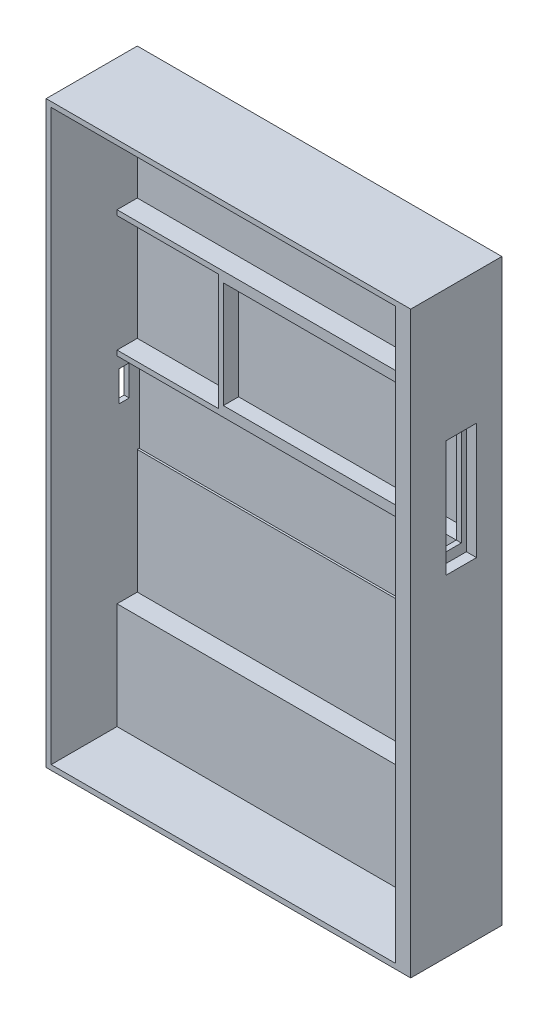
ISO-10303-21;
HEADER;
FILE_DESCRIPTION(('STEP AP214'),'2;1');
FILE_NAME('part.step','',(''),(''),'','','');
FILE_SCHEMA(('AUTOMOTIVE_DESIGN { 1 0 10303 214 1 1 1 1 }'));
ENDSEC;
DATA;
#1=APPLICATION_CONTEXT('core data for automotive mechanical design processes');
#2=APPLICATION_PROTOCOL_DEFINITION('international standard','automotive_design',2000,#1);
#3=PRODUCT_CONTEXT('',#1,'mechanical');
#4=PRODUCT('Part','Part','',(#3));
#5=PRODUCT_RELATED_PRODUCT_CATEGORY('part','',(#4));
#6=PRODUCT_DEFINITION_FORMATION('','',#4);
#7=PRODUCT_DEFINITION_CONTEXT('part definition',#1,'design');
#8=PRODUCT_DEFINITION('design','',#6,#7);
#9=PRODUCT_DEFINITION_SHAPE('','',#8);
#10=(LENGTH_UNIT() NAMED_UNIT(*) SI_UNIT(.MILLI.,.METRE.));
#11=(NAMED_UNIT(*) PLANE_ANGLE_UNIT() SI_UNIT($,.RADIAN.));
#12=(NAMED_UNIT(*) SI_UNIT($,.STERADIAN.) SOLID_ANGLE_UNIT());
#13=UNCERTAINTY_MEASURE_WITH_UNIT(LENGTH_MEASURE(1.E-05),#10,'distance_accuracy_value','');
#14=(GEOMETRIC_REPRESENTATION_CONTEXT(3) GLOBAL_UNCERTAINTY_ASSIGNED_CONTEXT((#13)) GLOBAL_UNIT_ASSIGNED_CONTEXT((#10,
#11,#12)) REPRESENTATION_CONTEXT('',''));
#15=CARTESIAN_POINT('',(0.,0.,0.));
#16=DIRECTION('',(0.,0.,1.));
#17=DIRECTION('',(1.,0.,0.));
#18=AXIS2_PLACEMENT_3D('',#15,#16,#17);
#19=CARTESIAN_POINT('',(0.,67.4,18.));
#20=DIRECTION('',(0.,-1.,0.));
#21=DIRECTION('',(0.,0.,-1.));
#22=AXIS2_PLACEMENT_3D('',#19,#20,#21);
#23=PLANE('',#22);
#24=DIRECTION('',(1.,0.,0.));
#25=VECTOR('',#24,1.);
#26=CARTESIAN_POINT('',(0.,67.4,5.));
#27=LINE('',#26,#25);
#28=CARTESIAN_POINT('',(0.,67.4,5.));
#29=VERTEX_POINT('',#28);
#30=CARTESIAN_POINT('',(68.,67.4,5.));
#31=VERTEX_POINT('',#30);
#32=EDGE_CURVE('E441',#29,#31,#27,.T.);
#33=ORIENTED_EDGE('',*,*,#32,.T.);
#34=DIRECTION('',(0.,0.,-1.));
#35=VECTOR('',#34,1.);
#36=CARTESIAN_POINT('',(68.,67.4,18.));
#37=LINE('',#36,#35);
#38=CARTESIAN_POINT('',(68.,67.4,1.));
#39=VERTEX_POINT('',#38);
#40=EDGE_CURVE('E494',#31,#39,#37,.T.);
#41=ORIENTED_EDGE('',*,*,#40,.T.);
#42=DIRECTION('',(1.,0.,0.));
#43=VECTOR('',#42,1.);
#44=CARTESIAN_POINT('',(0.,67.4,1.));
#45=LINE('',#44,#43);
#46=CARTESIAN_POINT('',(0.,67.4,1.));
#47=VERTEX_POINT('',#46);
#48=EDGE_CURVE('E508',#47,#39,#45,.T.);
#49=ORIENTED_EDGE('',*,*,#48,.F.);
#50=DIRECTION('',(0.,0.,-1.));
#51=VECTOR('',#50,1.);
#52=CARTESIAN_POINT('',(0.,67.4,18.));
#53=LINE('',#52,#51);
#54=EDGE_CURVE('E496',#29,#47,#53,.T.);
#55=ORIENTED_EDGE('',*,*,#54,.F.);
#56=EDGE_LOOP('',(#33,#41,#49,#55));
#57=FACE_BOUND('',#56,.T.);
#58=ADVANCED_FACE('F129',(#57),#23,.F.);
#59=CARTESIAN_POINT('',(55.8,0.,18.));
#60=DIRECTION('',(-1.,0.,0.));
#61=DIRECTION('',(0.,0.,1.));
#62=AXIS2_PLACEMENT_3D('',#59,#60,#61);
#63=PLANE('',#62);
#64=DIRECTION('',(0.,0.,-1.));
#65=VECTOR('',#64,1.);
#66=CARTESIAN_POINT('',(55.8,0.,18.));
#67=LINE('',#66,#65);
#68=CARTESIAN_POINT('',(55.8,0.,5.));
#69=VERTEX_POINT('',#68);
#70=CARTESIAN_POINT('',(55.8,0.,1.));
#71=VERTEX_POINT('',#70);
#72=EDGE_CURVE('E624',#69,#71,#67,.T.);
#73=ORIENTED_EDGE('',*,*,#72,.F.);
#74=DIRECTION('',(0.,1.,0.));
#75=VECTOR('',#74,1.);
#76=CARTESIAN_POINT('',(55.8,-21.,5.));
#77=LINE('',#76,#75);
#78=CARTESIAN_POINT('',(55.8,42.4,5.));
#79=VERTEX_POINT('',#78);
#80=EDGE_CURVE('E396',#69,#79,#77,.T.);
#81=ORIENTED_EDGE('',*,*,#80,.T.);
#82=DIRECTION('',(0.,0.,-1.));
#83=VECTOR('',#82,1.);
#84=CARTESIAN_POINT('',(55.8,42.4,18.));
#85=LINE('',#84,#83);
#86=CARTESIAN_POINT('',(55.8,42.4,0.6));
#87=VERTEX_POINT('',#86);
#88=EDGE_CURVE('E622',#79,#87,#85,.T.);
#89=ORIENTED_EDGE('',*,*,#88,.T.);
#90=DIRECTION('',(0.,1.,0.));
#91=VECTOR('',#90,1.);
#92=CARTESIAN_POINT('',(55.8,42.4,0.6));
#93=LINE('',#92,#91);
#94=CARTESIAN_POINT('',(55.8,24.4,0.6));
#95=VERTEX_POINT('',#94);
#96=EDGE_CURVE('E564',#95,#87,#93,.T.);
#97=ORIENTED_EDGE('',*,*,#96,.F.);
#98=DIRECTION('',(0.,0.,1.));
#99=VECTOR('',#98,1.);
#100=CARTESIAN_POINT('',(55.8,24.4,0.6));
#101=LINE('',#100,#99);
#102=CARTESIAN_POINT('',(55.8,24.4,1.));
#103=VERTEX_POINT('',#102);
#104=EDGE_CURVE('E573',#95,#103,#101,.T.);
#105=ORIENTED_EDGE('',*,*,#104,.T.);
#106=DIRECTION('',(0.,1.,0.));
#107=VECTOR('',#106,1.);
#108=CARTESIAN_POINT('',(55.8,0.,1.));
#109=LINE('',#108,#107);
#110=EDGE_CURVE('E615',#71,#103,#109,.T.);
#111=ORIENTED_EDGE('',*,*,#110,.F.);
#112=EDGE_LOOP('',(#73,#81,#89,#97,#105,#111));
#113=FACE_BOUND('',#112,.T.);
#114=ADVANCED_FACE('F694',(#113),#63,.T.);
#115=CARTESIAN_POINT('',(0.,0.,18.));
#116=DIRECTION('',(0.,0.,1.));
#117=DIRECTION('',(1.,0.,0.));
#118=AXIS2_PLACEMENT_3D('',#115,#116,#117);
#119=PLANE('',#118);
#120=DIRECTION('',(0.,-1.,0.));
#121=VECTOR('',#120,1.);
#122=CARTESIAN_POINT('',(-1.,0.,18.));
#123=LINE('',#122,#121);
#124=CARTESIAN_POINT('',(-1.,92.4,18.));
#125=VERTEX_POINT('',#124);
#126=CARTESIAN_POINT('',(-1.,-22.,18.));
#127=VERTEX_POINT('',#126);
#128=EDGE_CURVE('E630',#125,#127,#123,.T.);
#129=ORIENTED_EDGE('',*,*,#128,.T.);
#130=DIRECTION('',(1.,0.,0.));
#131=VECTOR('',#130,1.);
#132=CARTESIAN_POINT('',(-1.,-22.,18.));
#133=LINE('',#132,#131);
#134=CARTESIAN_POINT('',(71.,-22.,18.));
#135=VERTEX_POINT('',#134);
#136=EDGE_CURVE('E402',#127,#135,#133,.T.);
#137=ORIENTED_EDGE('',*,*,#136,.T.);
#138=DIRECTION('',(0.,1.,0.));
#139=VECTOR('',#138,1.);
#140=CARTESIAN_POINT('',(71.,92.4,18.));
#141=LINE('',#140,#139);
#142=CARTESIAN_POINT('',(71.,92.4,18.));
#143=VERTEX_POINT('',#142);
#144=EDGE_CURVE('E476',#135,#143,#141,.T.);
#145=ORIENTED_EDGE('',*,*,#144,.T.);
#146=DIRECTION('',(-1.,0.,0.));
#147=VECTOR('',#146,1.);
#148=CARTESIAN_POINT('',(0.,92.4,18.));
#149=LINE('',#148,#147);
#150=EDGE_CURVE('E499',#143,#125,#149,.T.);
#151=ORIENTED_EDGE('',*,*,#150,.T.);
#152=EDGE_LOOP('',(#129,#137,#145,#151));
#153=FACE_BOUND('',#152,.T.);
#154=DIRECTION('',(0.,1.,0.));
#155=VECTOR('',#154,1.);
#156=CARTESIAN_POINT('',(68.,67.4,18.));
#157=LINE('',#156,#155);
#158=CARTESIAN_POINT('',(68.,-21.,18.));
#159=VERTEX_POINT('',#158);
#160=CARTESIAN_POINT('',(68.,91.4,18.));
#161=VERTEX_POINT('',#160);
#162=EDGE_CURVE('E484',#159,#161,#157,.T.);
#163=ORIENTED_EDGE('',*,*,#162,.F.);
#164=DIRECTION('',(-1.,0.,0.));
#165=VECTOR('',#164,1.);
#166=CARTESIAN_POINT('',(55.8,-21.,18.));
#167=LINE('',#166,#165);
#168=CARTESIAN_POINT('',(0.,-21.,18.));
#169=VERTEX_POINT('',#168);
#170=EDGE_CURVE('E405',#159,#169,#167,.T.);
#171=ORIENTED_EDGE('',*,*,#170,.T.);
#172=DIRECTION('',(0.,-1.,0.));
#173=VECTOR('',#172,1.);
#174=CARTESIAN_POINT('',(0.,0.,18.));
#175=LINE('',#174,#173);
#176=CARTESIAN_POINT('',(0.,91.4,18.));
#177=VERTEX_POINT('',#176);
#178=EDGE_CURVE('E618',#177,#169,#175,.T.);
#179=ORIENTED_EDGE('',*,*,#178,.F.);
#180=DIRECTION('',(-1.,0.,0.));
#181=VECTOR('',#180,1.);
#182=CARTESIAN_POINT('',(0.,91.4,18.));
#183=LINE('',#182,#181);
#184=EDGE_CURVE('E486',#161,#177,#183,.T.);
#185=ORIENTED_EDGE('',*,*,#184,.F.);
#186=EDGE_LOOP('',(#163,#171,#179,#185));
#187=FACE_BOUND('',#186,.T.);
#188=ADVANCED_FACE('F711',(#153,#187),#119,.T.);
#189=CARTESIAN_POINT('',(21.,44.4,18.));
#190=DIRECTION('',(0.,1.,0.));
#191=DIRECTION('',(0.,0.,1.));
#192=AXIS2_PLACEMENT_3D('',#189,#190,#191);
#193=PLANE('',#192);
#194=DIRECTION('',(-1.,0.,0.));
#195=VECTOR('',#194,1.);
#196=CARTESIAN_POINT('',(21.,44.4,5.));
#197=LINE('',#196,#195);
#198=CARTESIAN_POINT('',(67.,44.4,5.));
#199=VERTEX_POINT('',#198);
#200=CARTESIAN_POINT('',(21.,44.4,5.));
#201=VERTEX_POINT('',#200);
#202=EDGE_CURVE('E432',#199,#201,#197,.T.);
#203=ORIENTED_EDGE('',*,*,#202,.F.);
#204=DIRECTION('',(0.,0.,-1.));
#205=VECTOR('',#204,1.);
#206=CARTESIAN_POINT('',(67.,44.4,18.));
#207=LINE('',#206,#205);
#208=CARTESIAN_POINT('',(67.,44.4,2.));
#209=VERTEX_POINT('',#208);
#210=EDGE_CURVE('E533',#199,#209,#207,.T.);
#211=ORIENTED_EDGE('',*,*,#210,.T.);
#212=DIRECTION('',(1.,0.,0.));
#213=VECTOR('',#212,1.);
#214=CARTESIAN_POINT('',(21.,44.4,2.));
#215=LINE('',#214,#213);
#216=CARTESIAN_POINT('',(21.,44.4,2.));
#217=VERTEX_POINT('',#216);
#218=EDGE_CURVE('E520',#217,#209,#215,.T.);
#219=ORIENTED_EDGE('',*,*,#218,.F.);
#220=DIRECTION('',(0.,0.,-1.));
#221=VECTOR('',#220,1.);
#222=CARTESIAN_POINT('',(21.,44.4,18.));
#223=LINE('',#222,#221);
#224=EDGE_CURVE('E535',#201,#217,#223,.T.);
#225=ORIENTED_EDGE('',*,*,#224,.F.);
#226=EDGE_LOOP('',(#203,#211,#219,#225));
#227=FACE_BOUND('',#226,.T.);
#228=ADVANCED_FACE('F713',(#227),#193,.T.);
#229=CARTESIAN_POINT('',(67.,65.4,18.));
#230=DIRECTION('',(-1.,0.,0.));
#231=DIRECTION('',(0.,0.,1.));
#232=AXIS2_PLACEMENT_3D('',#229,#230,#231);
#233=PLANE('',#232);
#234=ORIENTED_EDGE('',*,*,#210,.F.);
#235=DIRECTION('',(0.,1.,0.));
#236=VECTOR('',#235,1.);
#237=CARTESIAN_POINT('',(67.,65.4,5.));
#238=LINE('',#237,#236);
#239=CARTESIAN_POINT('',(67.,65.4,5.));
#240=VERTEX_POINT('',#239);
#241=EDGE_CURVE('E398',#199,#240,#238,.T.);
#242=ORIENTED_EDGE('',*,*,#241,.T.);
#243=DIRECTION('',(0.,0.,-1.));
#244=VECTOR('',#243,1.);
#245=CARTESIAN_POINT('',(67.,65.4,18.));
#246=LINE('',#245,#244);
#247=CARTESIAN_POINT('',(67.,65.4,2.));
#248=VERTEX_POINT('',#247);
#249=EDGE_CURVE('E531',#240,#248,#246,.T.);
#250=ORIENTED_EDGE('',*,*,#249,.T.);
#251=DIRECTION('',(0.,1.,0.));
#252=VECTOR('',#251,1.);
#253=CARTESIAN_POINT('',(67.,65.4,2.));
#254=LINE('',#253,#252);
#255=EDGE_CURVE('E523',#209,#248,#254,.T.);
#256=ORIENTED_EDGE('',*,*,#255,.F.);
#257=EDGE_LOOP('',(#234,#242,#250,#256));
#258=FACE_BOUND('',#257,.T.);
#259=ADVANCED_FACE('F720',(#258),#233,.T.);
#260=CARTESIAN_POINT('',(21.,65.4,18.));
#261=DIRECTION('',(0.,-1.,0.));
#262=DIRECTION('',(1.,0.,0.));
#263=AXIS2_PLACEMENT_3D('',#260,#261,#262);
#264=PLANE('',#263);
#265=ORIENTED_EDGE('',*,*,#249,.F.);
#266=DIRECTION('',(1.,0.,0.));
#267=VECTOR('',#266,1.);
#268=CARTESIAN_POINT('',(21.,65.4,5.));
#269=LINE('',#268,#267);
#270=CARTESIAN_POINT('',(21.,65.4,5.));
#271=VERTEX_POINT('',#270);
#272=EDGE_CURVE('E427',#271,#240,#269,.T.);
#273=ORIENTED_EDGE('',*,*,#272,.F.);
#274=DIRECTION('',(0.,0.,-1.));
#275=VECTOR('',#274,1.);
#276=CARTESIAN_POINT('',(21.,65.4,18.));
#277=LINE('',#276,#275);
#278=CARTESIAN_POINT('',(21.,65.4,2.));
#279=VERTEX_POINT('',#278);
#280=EDGE_CURVE('E529',#271,#279,#277,.T.);
#281=ORIENTED_EDGE('',*,*,#280,.T.);
#282=DIRECTION('',(-1.,0.,0.));
#283=VECTOR('',#282,1.);
#284=CARTESIAN_POINT('',(21.,65.4,2.));
#285=LINE('',#284,#283);
#286=EDGE_CURVE('E526',#248,#279,#285,.T.);
#287=ORIENTED_EDGE('',*,*,#286,.F.);
#288=EDGE_LOOP('',(#265,#273,#281,#287));
#289=FACE_BOUND('',#288,.T.);
#290=ADVANCED_FACE('F820',(#289),#264,.T.);
#291=CARTESIAN_POINT('',(0.,43.4,18.));
#292=DIRECTION('',(0.,-1.,0.));
#293=DIRECTION('',(0.,0.,-1.));
#294=AXIS2_PLACEMENT_3D('',#291,#292,#293);
#295=PLANE('',#294);
#296=DIRECTION('',(0.,0.,-1.));
#297=VECTOR('',#296,1.);
#298=CARTESIAN_POINT('',(0.,43.4,18.));
#299=LINE('',#298,#297);
#300=CARTESIAN_POINT('',(0.,43.4,5.));
#301=VERTEX_POINT('',#300);
#302=CARTESIAN_POINT('',(0.,43.4,1.));
#303=VERTEX_POINT('',#302);
#304=EDGE_CURVE('E555',#301,#303,#299,.T.);
#305=ORIENTED_EDGE('',*,*,#304,.F.);
#306=DIRECTION('',(1.,0.,0.));
#307=VECTOR('',#306,1.);
#308=CARTESIAN_POINT('',(0.,43.4,5.));
#309=LINE('',#308,#307);
#310=CARTESIAN_POINT('',(20.,43.4,5.));
#311=VERTEX_POINT('',#310);
#312=EDGE_CURVE('E438',#301,#311,#309,.T.);
#313=ORIENTED_EDGE('',*,*,#312,.T.);
#314=DIRECTION('',(0.,0.,-1.));
#315=VECTOR('',#314,1.);
#316=CARTESIAN_POINT('',(20.,43.4,18.));
#317=LINE('',#316,#315);
#318=CARTESIAN_POINT('',(20.,43.4,1.));
#319=VERTEX_POINT('',#318);
#320=EDGE_CURVE('E553',#311,#319,#317,.T.);
#321=ORIENTED_EDGE('',*,*,#320,.T.);
#322=DIRECTION('',(1.,0.,0.));
#323=VECTOR('',#322,1.);
#324=CARTESIAN_POINT('',(0.,43.4,1.));
#325=LINE('',#324,#323);
#326=EDGE_CURVE('E540',#303,#319,#325,.T.);
#327=ORIENTED_EDGE('',*,*,#326,.F.);
#328=EDGE_LOOP('',(#305,#313,#321,#327));
#329=FACE_BOUND('',#328,.T.);
#330=ADVANCED_FACE('F679',(#329),#295,.F.);
#331=CARTESIAN_POINT('',(20.,43.4,18.));
#332=DIRECTION('',(-1.,0.,0.));
#333=DIRECTION('',(0.,0.,1.));
#334=AXIS2_PLACEMENT_3D('',#331,#332,#333);
#335=PLANE('',#334);
#336=DIRECTION('',(0.,-1.,0.));
#337=VECTOR('',#336,1.);
#338=CARTESIAN_POINT('',(20.,43.4,5.));
#339=LINE('',#338,#337);
#340=CARTESIAN_POINT('',(20.,66.4,5.));
#341=VERTEX_POINT('',#340);
#342=EDGE_CURVE('E436',#341,#311,#339,.T.);
#343=ORIENTED_EDGE('',*,*,#342,.F.);
#344=DIRECTION('',(0.,0.,-1.));
#345=VECTOR('',#344,1.);
#346=CARTESIAN_POINT('',(20.,66.4,18.));
#347=LINE('',#346,#345);
#348=CARTESIAN_POINT('',(20.,66.4,1.));
#349=VERTEX_POINT('',#348);
#350=EDGE_CURVE('E551',#341,#349,#347,.T.);
#351=ORIENTED_EDGE('',*,*,#350,.T.);
#352=DIRECTION('',(0.,1.,0.));
#353=VECTOR('',#352,1.);
#354=CARTESIAN_POINT('',(20.,43.4,1.));
#355=LINE('',#354,#353);
#356=EDGE_CURVE('E543',#319,#349,#355,.T.);
#357=ORIENTED_EDGE('',*,*,#356,.F.);
#358=ORIENTED_EDGE('',*,*,#320,.F.);
#359=EDGE_LOOP('',(#343,#351,#357,#358));
#360=FACE_BOUND('',#359,.T.);
#361=ADVANCED_FACE('F672',(#360),#335,.T.);
#362=CARTESIAN_POINT('',(0.,66.4,18.));
#363=DIRECTION('',(0.,-1.,0.));
#364=DIRECTION('',(0.,0.,-1.));
#365=AXIS2_PLACEMENT_3D('',#362,#363,#364);
#366=PLANE('',#365);
#367=DIRECTION('',(1.,0.,0.));
#368=VECTOR('',#367,1.);
#369=CARTESIAN_POINT('',(0.,66.4,5.));
#370=LINE('',#369,#368);
#371=CARTESIAN_POINT('',(0.,66.4,5.));
#372=VERTEX_POINT('',#371);
#373=EDGE_CURVE('E434',#372,#341,#370,.T.);
#374=ORIENTED_EDGE('',*,*,#373,.F.);
#375=DIRECTION('',(0.,0.,-1.));
#376=VECTOR('',#375,1.);
#377=CARTESIAN_POINT('',(0.,66.4,18.));
#378=LINE('',#377,#376);
#379=CARTESIAN_POINT('',(0.,66.4,1.));
#380=VERTEX_POINT('',#379);
#381=EDGE_CURVE('E549',#372,#380,#378,.T.);
#382=ORIENTED_EDGE('',*,*,#381,.T.);
#383=DIRECTION('',(-1.,0.,0.));
#384=VECTOR('',#383,1.);
#385=CARTESIAN_POINT('',(0.,66.4,1.));
#386=LINE('',#385,#384);
#387=EDGE_CURVE('E546',#349,#380,#386,.T.);
#388=ORIENTED_EDGE('',*,*,#387,.F.);
#389=ORIENTED_EDGE('',*,*,#350,.F.);
#390=EDGE_LOOP('',(#374,#382,#388,#389));
#391=FACE_BOUND('',#390,.T.);
#392=ADVANCED_FACE('F668',(#391),#366,.T.);
#393=CARTESIAN_POINT('',(0.,0.,1.));
#394=DIRECTION('',(0.,0.,-1.));
#395=DIRECTION('',(-1.,0.,0.));
#396=AXIS2_PLACEMENT_3D('',#393,#394,#395);
#397=PLANE('',#396);
#398=DIRECTION('',(1.,0.,0.));
#399=VECTOR('',#398,1.);
#400=CARTESIAN_POINT('',(0.,24.4,1.));
#401=LINE('',#400,#399);
#402=CARTESIAN_POINT('',(0.,24.4,1.));
#403=VERTEX_POINT('',#402);
#404=EDGE_CURVE('E557',#403,#103,#401,.T.);
#405=ORIENTED_EDGE('',*,*,#404,.F.);
#406=DIRECTION('',(0.,-1.,0.));
#407=VECTOR('',#406,1.);
#408=CARTESIAN_POINT('',(0.,0.,1.));
#409=LINE('',#408,#407);
#410=CARTESIAN_POINT('',(0.,0.,1.));
#411=VERTEX_POINT('',#410);
#412=EDGE_CURVE('E610',#403,#411,#409,.T.);
#413=ORIENTED_EDGE('',*,*,#412,.T.);
#414=DIRECTION('',(1.,0.,0.));
#415=VECTOR('',#414,1.);
#416=CARTESIAN_POINT('',(0.,0.,1.));
#417=LINE('',#416,#415);
#418=EDGE_CURVE('E612',#411,#71,#417,.T.);
#419=ORIENTED_EDGE('',*,*,#418,.T.);
#420=ORIENTED_EDGE('',*,*,#110,.T.);
#421=EDGE_LOOP('',(#405,#413,#419,#420));
#422=FACE_BOUND('',#421,.T.);
#423=ADVANCED_FACE('F759',(#422),#397,.F.);
#424=CARTESIAN_POINT('',(0.,0.,18.));
#425=DIRECTION('',(0.,1.,0.));
#426=DIRECTION('',(0.,0.,1.));
#427=AXIS2_PLACEMENT_3D('',#424,#425,#426);
#428=PLANE('',#427);
#429=DIRECTION('',(0.,0.,-1.));
#430=VECTOR('',#429,1.);
#431=CARTESIAN_POINT('',(0.,0.,18.));
#432=LINE('',#431,#430);
#433=CARTESIAN_POINT('',(0.,0.,5.));
#434=VERTEX_POINT('',#433);
#435=EDGE_CURVE('E626',#434,#411,#432,.T.);
#436=ORIENTED_EDGE('',*,*,#435,.F.);
#437=DIRECTION('',(-1.,0.,0.));
#438=VECTOR('',#437,1.);
#439=CARTESIAN_POINT('',(0.,0.,5.));
#440=LINE('',#439,#438);
#441=EDGE_CURVE('E607',#69,#434,#440,.T.);
#442=ORIENTED_EDGE('',*,*,#441,.F.);
#443=ORIENTED_EDGE('',*,*,#72,.T.);
#444=ORIENTED_EDGE('',*,*,#418,.F.);
#445=EDGE_LOOP('',(#436,#442,#443,#444));
#446=FACE_BOUND('',#445,.T.);
#447=ADVANCED_FACE('F699',(#446),#428,.T.);
#448=CARTESIAN_POINT('',(0.,0.,18.));
#449=DIRECTION('',(1.,0.,0.));
#450=DIRECTION('',(0.,0.,-1.));
#451=AXIS2_PLACEMENT_3D('',#448,#449,#450);
#452=PLANE('',#451);
#453=DIRECTION('',(0.,-1.,0.));
#454=VECTOR('',#453,1.);
#455=CARTESIAN_POINT('',(0.,0.,4.6));
#456=LINE('',#455,#454);
#457=CARTESIAN_POINT('',(0.,40.,4.6));
#458=VERTEX_POINT('',#457);
#459=CARTESIAN_POINT('',(0.,34.,4.6));
#460=VERTEX_POINT('',#459);
#461=EDGE_CURVE('E603',#458,#460,#456,.T.);
#462=ORIENTED_EDGE('',*,*,#461,.F.);
#463=DIRECTION('',(0.,0.,1.));
#464=VECTOR('',#463,1.);
#465=CARTESIAN_POINT('',(0.,40.,18.));
#466=LINE('',#465,#464);
#467=CARTESIAN_POINT('',(0.,40.,2.6));
#468=VERTEX_POINT('',#467);
#469=EDGE_CURVE('E590',#468,#458,#466,.T.);
#470=ORIENTED_EDGE('',*,*,#469,.F.);
#471=DIRECTION('',(0.,1.,0.));
#472=VECTOR('',#471,1.);
#473=CARTESIAN_POINT('',(0.,0.,2.6));
#474=LINE('',#473,#472);
#475=CARTESIAN_POINT('',(0.,34.,2.6));
#476=VERTEX_POINT('',#475);
#477=EDGE_CURVE('E598',#476,#468,#474,.T.);
#478=ORIENTED_EDGE('',*,*,#477,.F.);
#479=DIRECTION('',(0.,0.,-1.));
#480=VECTOR('',#479,1.);
#481=CARTESIAN_POINT('',(0.,34.,18.));
#482=LINE('',#481,#480);
#483=EDGE_CURVE('E601',#460,#476,#482,.T.);
#484=ORIENTED_EDGE('',*,*,#483,.F.);
#485=EDGE_LOOP('',(#462,#470,#478,#484));
#486=FACE_BOUND('',#485,.T.);
#487=ORIENTED_EDGE('',*,*,#178,.T.);
#488=DIRECTION('',(0.,0.,-1.));
#489=VECTOR('',#488,1.);
#490=CARTESIAN_POINT('',(0.,-21.,18.));
#491=LINE('',#490,#489);
#492=CARTESIAN_POINT('',(0.,-21.,5.));
#493=VERTEX_POINT('',#492);
#494=EDGE_CURVE('E408',#169,#493,#491,.T.);
#495=ORIENTED_EDGE('',*,*,#494,.T.);
#496=DIRECTION('',(0.,-1.,0.));
#497=VECTOR('',#496,1.);
#498=CARTESIAN_POINT('',(0.,0.,5.));
#499=LINE('',#498,#497);
#500=EDGE_CURVE('E605',#434,#493,#499,.T.);
#501=ORIENTED_EDGE('',*,*,#500,.F.);
#502=ORIENTED_EDGE('',*,*,#435,.T.);
#503=ORIENTED_EDGE('',*,*,#412,.F.);
#504=DIRECTION('',(0.,0.,1.));
#505=VECTOR('',#504,1.);
#506=CARTESIAN_POINT('',(0.,24.4,0.6));
#507=LINE('',#506,#505);
#508=CARTESIAN_POINT('',(0.,24.4,0.6));
#509=VERTEX_POINT('',#508);
#510=EDGE_CURVE('E570',#509,#403,#507,.T.);
#511=ORIENTED_EDGE('',*,*,#510,.F.);
#512=DIRECTION('',(0.,-1.,0.));
#513=VECTOR('',#512,1.);
#514=CARTESIAN_POINT('',(0.,42.4,0.6));
#515=LINE('',#514,#513);
#516=CARTESIAN_POINT('',(0.,42.4,0.6));
#517=VERTEX_POINT('',#516);
#518=EDGE_CURVE('E558',#517,#509,#515,.T.);
#519=ORIENTED_EDGE('',*,*,#518,.F.);
#520=DIRECTION('',(0.,0.,-1.));
#521=VECTOR('',#520,1.);
#522=CARTESIAN_POINT('',(0.,42.4,18.));
#523=LINE('',#522,#521);
#524=CARTESIAN_POINT('',(0.,42.4,5.));
#525=VERTEX_POINT('',#524);
#526=EDGE_CURVE('E620',#525,#517,#523,.T.);
#527=ORIENTED_EDGE('',*,*,#526,.F.);
#528=DIRECTION('',(0.,-1.,0.));
#529=VECTOR('',#528,1.);
#530=CARTESIAN_POINT('',(0.,82.4,5.));
#531=LINE('',#530,#529);
#532=EDGE_CURVE('E424',#301,#525,#531,.T.);
#533=ORIENTED_EDGE('',*,*,#532,.F.);
#534=ORIENTED_EDGE('',*,*,#304,.T.);
#535=DIRECTION('',(0.,-1.,0.));
#536=VECTOR('',#535,1.);
#537=CARTESIAN_POINT('',(0.,43.4,1.));
#538=LINE('',#537,#536);
#539=EDGE_CURVE('E537',#380,#303,#538,.T.);
#540=ORIENTED_EDGE('',*,*,#539,.F.);
#541=ORIENTED_EDGE('',*,*,#381,.F.);
#542=EDGE_CURVE('E426',#29,#372,#531,.T.);
#543=ORIENTED_EDGE('',*,*,#542,.F.);
#544=ORIENTED_EDGE('',*,*,#54,.T.);
#545=DIRECTION('',(0.,-1.,0.));
#546=VECTOR('',#545,1.);
#547=CARTESIAN_POINT('',(0.,67.4,1.));
#548=LINE('',#547,#546);
#549=CARTESIAN_POINT('',(0.,91.4,1.));
#550=VERTEX_POINT('',#549);
#551=EDGE_CURVE('E505',#550,#47,#548,.T.);
#552=ORIENTED_EDGE('',*,*,#551,.F.);
#553=DIRECTION('',(0.,0.,-1.));
#554=VECTOR('',#553,1.);
#555=CARTESIAN_POINT('',(0.,91.4,18.));
#556=LINE('',#555,#554);
#557=EDGE_CURVE('E489',#177,#550,#556,.T.);
#558=ORIENTED_EDGE('',*,*,#557,.F.);
#559=EDGE_LOOP('',(#487,#495,#501,#502,#503,#511,#519,#527,#533,#534,#540,#541,#543,#544,#552,#558));
#560=FACE_BOUND('',#559,.T.);
#561=ADVANCED_FACE('F658',(#486,#560),#452,.T.);
#562=CARTESIAN_POINT('',(0.,42.4,18.));
#563=DIRECTION('',(0.,-1.,0.));
#564=DIRECTION('',(0.,0.,-1.));
#565=AXIS2_PLACEMENT_3D('',#562,#563,#564);
#566=PLANE('',#565);
#567=DIRECTION('',(1.,0.,0.));
#568=VECTOR('',#567,1.);
#569=CARTESIAN_POINT('',(0.,42.4,5.));
#570=LINE('',#569,#568);
#571=EDGE_CURVE('E421',#525,#79,#570,.T.);
#572=ORIENTED_EDGE('',*,*,#571,.F.);
#573=ORIENTED_EDGE('',*,*,#526,.T.);
#574=DIRECTION('',(-1.,0.,0.));
#575=VECTOR('',#574,1.);
#576=CARTESIAN_POINT('',(0.,42.4,0.6));
#577=LINE('',#576,#575);
#578=EDGE_CURVE('E567',#87,#517,#577,.T.);
#579=ORIENTED_EDGE('',*,*,#578,.F.);
#580=ORIENTED_EDGE('',*,*,#88,.F.);
#581=EDGE_LOOP('',(#572,#573,#579,#580));
#582=FACE_BOUND('',#581,.T.);
#583=ADVANCED_FACE('F686',(#582),#566,.T.);
#584=CARTESIAN_POINT('',(0.,0.,0.));
#585=DIRECTION('',(0.,0.,1.));
#586=DIRECTION('',(1.,0.,0.));
#587=AXIS2_PLACEMENT_3D('',#584,#585,#586);
#588=PLANE('',#587);
#589=DIRECTION('',(0.,1.,0.));
#590=VECTOR('',#589,1.);
#591=CARTESIAN_POINT('',(71.,92.4,0.));
#592=LINE('',#591,#590);
#593=CARTESIAN_POINT('',(71.,-22.,0.));
#594=VERTEX_POINT('',#593);
#595=CARTESIAN_POINT('',(71.,92.4,0.));
#596=VERTEX_POINT('',#595);
#597=EDGE_CURVE('E469',#594,#596,#592,.T.);
#598=ORIENTED_EDGE('',*,*,#597,.F.);
#599=DIRECTION('',(1.,0.,0.));
#600=VECTOR('',#599,1.);
#601=CARTESIAN_POINT('',(-1.,-22.,0.));
#602=LINE('',#601,#600);
#603=CARTESIAN_POINT('',(-1.,-22.,0.));
#604=VERTEX_POINT('',#603);
#605=EDGE_CURVE('E401',#604,#594,#602,.T.);
#606=ORIENTED_EDGE('',*,*,#605,.F.);
#607=DIRECTION('',(0.,-1.,0.));
#608=VECTOR('',#607,1.);
#609=CARTESIAN_POINT('',(-1.,0.,0.));
#610=LINE('',#609,#608);
#611=CARTESIAN_POINT('',(-1.,92.4,0.));
#612=VERTEX_POINT('',#611);
#613=EDGE_CURVE('E629',#612,#604,#610,.T.);
#614=ORIENTED_EDGE('',*,*,#613,.F.);
#615=DIRECTION('',(-1.,0.,0.));
#616=VECTOR('',#615,1.);
#617=CARTESIAN_POINT('',(0.,92.4,0.));
#618=LINE('',#617,#616);
#619=EDGE_CURVE('E498',#596,#612,#618,.T.);
#620=ORIENTED_EDGE('',*,*,#619,.F.);
#621=EDGE_LOOP('',(#598,#606,#614,#620));
#622=FACE_BOUND('',#621,.T.);
#623=ADVANCED_FACE('F764',(#622),#588,.F.);
#624=CARTESIAN_POINT('',(-1.,0.,18.));
#625=DIRECTION('',(1.,0.,0.));
#626=DIRECTION('',(0.,0.,-1.));
#627=AXIS2_PLACEMENT_3D('',#624,#625,#626);
#628=PLANE('',#627);
#629=ORIENTED_EDGE('',*,*,#613,.T.);
#630=DIRECTION('',(0.,0.,-1.));
#631=VECTOR('',#630,1.);
#632=CARTESIAN_POINT('',(-1.,-22.,18.));
#633=LINE('',#632,#631);
#634=EDGE_CURVE('E416',#127,#604,#633,.T.);
#635=ORIENTED_EDGE('',*,*,#634,.F.);
#636=ORIENTED_EDGE('',*,*,#128,.F.);
#637=DIRECTION('',(0.,0.,-1.));
#638=VECTOR('',#637,1.);
#639=CARTESIAN_POINT('',(-1.,92.4,18.));
#640=LINE('',#639,#638);
#641=EDGE_CURVE('E501',#125,#612,#640,.T.);
#642=ORIENTED_EDGE('',*,*,#641,.T.);
#643=EDGE_LOOP('',(#629,#635,#636,#642));
#644=FACE_BOUND('',#643,.T.);
#645=DIRECTION('',(0.,0.,-1.));
#646=VECTOR('',#645,1.);
#647=CARTESIAN_POINT('',(-1.,40.,4.6));
#648=LINE('',#647,#646);
#649=CARTESIAN_POINT('',(-1.,40.,4.6));
#650=VERTEX_POINT('',#649);
#651=CARTESIAN_POINT('',(-1.,40.,2.6));
#652=VERTEX_POINT('',#651);
#653=EDGE_CURVE('E578',#650,#652,#648,.T.);
#654=ORIENTED_EDGE('',*,*,#653,.F.);
#655=DIRECTION('',(0.,1.,0.));
#656=VECTOR('',#655,1.);
#657=CARTESIAN_POINT('',(-1.,40.,4.6));
#658=LINE('',#657,#656);
#659=CARTESIAN_POINT('',(-1.,34.,4.6));
#660=VERTEX_POINT('',#659);
#661=EDGE_CURVE('E575',#660,#650,#658,.T.);
#662=ORIENTED_EDGE('',*,*,#661,.F.);
#663=DIRECTION('',(0.,0.,1.));
#664=VECTOR('',#663,1.);
#665=CARTESIAN_POINT('',(-1.,34.,4.6));
#666=LINE('',#665,#664);
#667=CARTESIAN_POINT('',(-1.,34.,2.6));
#668=VERTEX_POINT('',#667);
#669=EDGE_CURVE('E584',#668,#660,#666,.T.);
#670=ORIENTED_EDGE('',*,*,#669,.F.);
#671=DIRECTION('',(0.,-1.,0.));
#672=VECTOR('',#671,1.);
#673=CARTESIAN_POINT('',(-1.,40.,2.6));
#674=LINE('',#673,#672);
#675=EDGE_CURVE('E581',#652,#668,#674,.T.);
#676=ORIENTED_EDGE('',*,*,#675,.F.);
#677=EDGE_LOOP('',(#654,#662,#670,#676));
#678=FACE_BOUND('',#677,.T.);
#679=ADVANCED_FACE('F131',(#644,#678),#628,.F.);
#680=CARTESIAN_POINT('',(9.,40.,4.6));
#681=DIRECTION('',(0.,0.,1.));
#682=DIRECTION('',(1.,0.,0.));
#683=AXIS2_PLACEMENT_3D('',#680,#681,#682);
#684=PLANE('',#683);
#685=ORIENTED_EDGE('',*,*,#461,.T.);
#686=DIRECTION('',(-1.,0.,0.));
#687=VECTOR('',#686,1.);
#688=CARTESIAN_POINT('',(9.,34.,4.6));
#689=LINE('',#688,#687);
#690=EDGE_CURVE('E588',#460,#660,#689,.T.);
#691=ORIENTED_EDGE('',*,*,#690,.T.);
#692=ORIENTED_EDGE('',*,*,#661,.T.);
#693=DIRECTION('',(-1.,0.,0.));
#694=VECTOR('',#693,1.);
#695=CARTESIAN_POINT('',(9.,40.,4.6));
#696=LINE('',#695,#694);
#697=EDGE_CURVE('E587',#458,#650,#696,.T.);
#698=ORIENTED_EDGE('',*,*,#697,.F.);
#699=EDGE_LOOP('',(#685,#691,#692,#698));
#700=FACE_BOUND('',#699,.T.);
#701=ADVANCED_FACE('F748',(#700),#684,.F.);
#702=CARTESIAN_POINT('',(9.,34.,4.6));
#703=DIRECTION('',(0.,-1.,0.));
#704=DIRECTION('',(0.,0.,-1.));
#705=AXIS2_PLACEMENT_3D('',#702,#703,#704);
#706=PLANE('',#705);
#707=ORIENTED_EDGE('',*,*,#483,.T.);
#708=DIRECTION('',(-1.,0.,0.));
#709=VECTOR('',#708,1.);
#710=CARTESIAN_POINT('',(9.,34.,2.6));
#711=LINE('',#710,#709);
#712=EDGE_CURVE('E591',#476,#668,#711,.T.);
#713=ORIENTED_EDGE('',*,*,#712,.T.);
#714=ORIENTED_EDGE('',*,*,#669,.T.);
#715=ORIENTED_EDGE('',*,*,#690,.F.);
#716=EDGE_LOOP('',(#707,#713,#714,#715));
#717=FACE_BOUND('',#716,.T.);
#718=ADVANCED_FACE('F744',(#717),#706,.F.);
#719=CARTESIAN_POINT('',(9.,40.,2.6));
#720=DIRECTION('',(0.,0.,-1.));
#721=DIRECTION('',(0.,1.,0.));
#722=AXIS2_PLACEMENT_3D('',#719,#720,#721);
#723=PLANE('',#722);
#724=ORIENTED_EDGE('',*,*,#477,.T.);
#725=DIRECTION('',(-1.,0.,0.));
#726=VECTOR('',#725,1.);
#727=CARTESIAN_POINT('',(9.,40.,2.6));
#728=LINE('',#727,#726);
#729=EDGE_CURVE('E593',#468,#652,#728,.T.);
#730=ORIENTED_EDGE('',*,*,#729,.T.);
#731=ORIENTED_EDGE('',*,*,#675,.T.);
#732=ORIENTED_EDGE('',*,*,#712,.F.);
#733=EDGE_LOOP('',(#724,#730,#731,#732));
#734=FACE_BOUND('',#733,.T.);
#735=ADVANCED_FACE('F747',(#734),#723,.F.);
#736=CARTESIAN_POINT('',(9.,40.,4.6));
#737=DIRECTION('',(0.,1.,0.));
#738=DIRECTION('',(0.,0.,1.));
#739=AXIS2_PLACEMENT_3D('',#736,#737,#738);
#740=PLANE('',#739);
#741=ORIENTED_EDGE('',*,*,#469,.T.);
#742=ORIENTED_EDGE('',*,*,#697,.T.);
#743=ORIENTED_EDGE('',*,*,#653,.T.);
#744=ORIENTED_EDGE('',*,*,#729,.F.);
#745=EDGE_LOOP('',(#741,#742,#743,#744));
#746=FACE_BOUND('',#745,.T.);
#747=ADVANCED_FACE('F742',(#746),#740,.F.);
#748=CARTESIAN_POINT('',(0.,24.4,0.6));
#749=DIRECTION('',(0.,-1.,0.));
#750=DIRECTION('',(0.,0.,-1.));
#751=AXIS2_PLACEMENT_3D('',#748,#749,#750);
#752=PLANE('',#751);
#753=ORIENTED_EDGE('',*,*,#404,.T.);
#754=ORIENTED_EDGE('',*,*,#104,.F.);
#755=DIRECTION('',(1.,0.,0.));
#756=VECTOR('',#755,1.);
#757=CARTESIAN_POINT('',(0.,24.4,0.6));
#758=LINE('',#757,#756);
#759=EDGE_CURVE('E561',#509,#95,#758,.T.);
#760=ORIENTED_EDGE('',*,*,#759,.F.);
#761=ORIENTED_EDGE('',*,*,#510,.T.);
#762=EDGE_LOOP('',(#753,#754,#760,#761));
#763=FACE_BOUND('',#762,.T.);
#764=ADVANCED_FACE('F739',(#763),#752,.F.);
#765=CARTESIAN_POINT('',(0.,0.,0.6));
#766=DIRECTION('',(0.,0.,1.));
#767=DIRECTION('',(1.,0.,0.));
#768=AXIS2_PLACEMENT_3D('',#765,#766,#767);
#769=PLANE('',#768);
#770=ORIENTED_EDGE('',*,*,#518,.T.);
#771=ORIENTED_EDGE('',*,*,#759,.T.);
#772=ORIENTED_EDGE('',*,*,#96,.T.);
#773=ORIENTED_EDGE('',*,*,#578,.T.);
#774=EDGE_LOOP('',(#770,#771,#772,#773));
#775=FACE_BOUND('',#774,.T.);
#776=ADVANCED_FACE('F689',(#775),#769,.T.);
#777=CARTESIAN_POINT('',(21.,0.,18.));
#778=DIRECTION('',(-1.,0.,0.));
#779=DIRECTION('',(0.,0.,1.));
#780=AXIS2_PLACEMENT_3D('',#777,#778,#779);
#781=PLANE('',#780);
#782=ORIENTED_EDGE('',*,*,#280,.F.);
#783=DIRECTION('',(0.,-1.,0.));
#784=VECTOR('',#783,1.);
#785=CARTESIAN_POINT('',(21.,0.,5.));
#786=LINE('',#785,#784);
#787=EDGE_CURVE('E429',#271,#201,#786,.T.);
#788=ORIENTED_EDGE('',*,*,#787,.T.);
#789=ORIENTED_EDGE('',*,*,#224,.T.);
#790=DIRECTION('',(0.,-1.,0.));
#791=VECTOR('',#790,1.);
#792=CARTESIAN_POINT('',(21.,65.4,2.));
#793=LINE('',#792,#791);
#794=EDGE_CURVE('E517',#279,#217,#793,.T.);
#795=ORIENTED_EDGE('',*,*,#794,.F.);
#796=EDGE_LOOP('',(#782,#788,#789,#795));
#797=FACE_BOUND('',#796,.T.);
#798=ADVANCED_FACE('F733',(#797),#781,.F.);
#799=CARTESIAN_POINT('',(0.,0.,1.));
#800=DIRECTION('',(0.,0.,-1.));
#801=DIRECTION('',(-1.,0.,0.));
#802=AXIS2_PLACEMENT_3D('',#799,#800,#801);
#803=PLANE('',#802);
#804=ORIENTED_EDGE('',*,*,#539,.T.);
#805=ORIENTED_EDGE('',*,*,#326,.T.);
#806=ORIENTED_EDGE('',*,*,#356,.T.);
#807=ORIENTED_EDGE('',*,*,#387,.T.);
#808=EDGE_LOOP('',(#804,#805,#806,#807));
#809=FACE_BOUND('',#808,.T.);
#810=ADVANCED_FACE('F675',(#809),#803,.F.);
#811=CARTESIAN_POINT('',(0.,0.,2.));
#812=DIRECTION('',(0.,0.,1.));
#813=DIRECTION('',(1.,0.,0.));
#814=AXIS2_PLACEMENT_3D('',#811,#812,#813);
#815=PLANE('',#814);
#816=ORIENTED_EDGE('',*,*,#794,.T.);
#817=ORIENTED_EDGE('',*,*,#218,.T.);
#818=ORIENTED_EDGE('',*,*,#255,.T.);
#819=ORIENTED_EDGE('',*,*,#286,.T.);
#820=EDGE_LOOP('',(#816,#817,#818,#819));
#821=FACE_BOUND('',#820,.T.);
#822=ADVANCED_FACE('F816',(#821),#815,.T.);
#823=CARTESIAN_POINT('',(0.,0.,1.));
#824=DIRECTION('',(0.,0.,-1.));
#825=DIRECTION('',(-1.,0.,0.));
#826=AXIS2_PLACEMENT_3D('',#823,#824,#825);
#827=PLANE('',#826);
#828=ORIENTED_EDGE('',*,*,#551,.T.);
#829=ORIENTED_EDGE('',*,*,#48,.T.);
#830=DIRECTION('',(0.,1.,0.));
#831=VECTOR('',#830,1.);
#832=CARTESIAN_POINT('',(68.,67.4,1.));
#833=LINE('',#832,#831);
#834=CARTESIAN_POINT('',(68.,91.4,1.));
#835=VERTEX_POINT('',#834);
#836=EDGE_CURVE('E511',#39,#835,#833,.T.);
#837=ORIENTED_EDGE('',*,*,#836,.T.);
#838=DIRECTION('',(-1.,0.,0.));
#839=VECTOR('',#838,1.);
#840=CARTESIAN_POINT('',(0.,91.4,1.));
#841=LINE('',#840,#839);
#842=EDGE_CURVE('E514',#835,#550,#841,.T.);
#843=ORIENTED_EDGE('',*,*,#842,.T.);
#844=EDGE_LOOP('',(#828,#829,#837,#843));
#845=FACE_BOUND('',#844,.T.);
#846=ADVANCED_FACE('F645',(#845),#827,.F.);
#847=CARTESIAN_POINT('',(68.,67.4,18.));
#848=DIRECTION('',(-1.,0.,0.));
#849=DIRECTION('',(0.,0.,1.));
#850=AXIS2_PLACEMENT_3D('',#847,#848,#849);
#851=PLANE('',#850);
#852=DIRECTION('',(0.,1.,0.));
#853=VECTOR('',#852,1.);
#854=CARTESIAN_POINT('',(68.,67.4,10.));
#855=LINE('',#854,#853);
#856=CARTESIAN_POINT('',(68.,45.4,10.));
#857=VERTEX_POINT('',#856);
#858=CARTESIAN_POINT('',(68.,65.4,10.));
#859=VERTEX_POINT('',#858);
#860=EDGE_CURVE('E12',#857,#859,#855,.T.);
#861=ORIENTED_EDGE('',*,*,#860,.F.);
#862=DIRECTION('',(0.,0.,1.));
#863=VECTOR('',#862,1.);
#864=CARTESIAN_POINT('',(68.,45.4,18.));
#865=LINE('',#864,#863);
#866=CARTESIAN_POINT('',(68.,45.4,5.99999999999999));
#867=VERTEX_POINT('',#866);
#868=EDGE_CURVE('E366',#867,#857,#865,.T.);
#869=ORIENTED_EDGE('',*,*,#868,.F.);
#870=DIRECTION('',(0.,-1.,0.));
#871=VECTOR('',#870,1.);
#872=CARTESIAN_POINT('',(68.,67.4,5.99999999999999));
#873=LINE('',#872,#871);
#874=CARTESIAN_POINT('',(68.,65.4,6.));
#875=VERTEX_POINT('',#874);
#876=EDGE_CURVE('E634',#875,#867,#873,.T.);
#877=ORIENTED_EDGE('',*,*,#876,.F.);
#878=DIRECTION('',(0.,0.,-1.));
#879=VECTOR('',#878,1.);
#880=CARTESIAN_POINT('',(68.,65.4,18.));
#881=LINE('',#880,#879);
#882=EDGE_CURVE('E137',#859,#875,#881,.T.);
#883=ORIENTED_EDGE('',*,*,#882,.F.);
#884=EDGE_LOOP('',(#861,#869,#877,#883));
#885=FACE_BOUND('',#884,.T.);
#886=ORIENTED_EDGE('',*,*,#40,.F.);
#887=DIRECTION('',(0.,1.,0.));
#888=VECTOR('',#887,1.);
#889=CARTESIAN_POINT('',(68.,-21.,5.));
#890=LINE('',#889,#888);
#891=CARTESIAN_POINT('',(68.,-21.,5.));
#892=VERTEX_POINT('',#891);
#893=EDGE_CURVE('E393',#892,#31,#890,.T.);
#894=ORIENTED_EDGE('',*,*,#893,.F.);
#895=DIRECTION('',(0.,0.,1.));
#896=VECTOR('',#895,1.);
#897=CARTESIAN_POINT('',(68.,-21.,18.));
#898=LINE('',#897,#896);
#899=EDGE_CURVE('E387',#892,#159,#898,.T.);
#900=ORIENTED_EDGE('',*,*,#899,.T.);
#901=ORIENTED_EDGE('',*,*,#162,.T.);
#902=DIRECTION('',(0.,0.,-1.));
#903=VECTOR('',#902,1.);
#904=CARTESIAN_POINT('',(68.,91.4,18.));
#905=LINE('',#904,#903);
#906=EDGE_CURVE('E491',#161,#835,#905,.T.);
#907=ORIENTED_EDGE('',*,*,#906,.T.);
#908=ORIENTED_EDGE('',*,*,#836,.F.);
#909=EDGE_LOOP('',(#886,#894,#900,#901,#907,#908));
#910=FACE_BOUND('',#909,.T.);
#911=ADVANCED_FACE('F641',(#885,#910),#851,.T.);
#912=CARTESIAN_POINT('',(0.,91.4,18.));
#913=DIRECTION('',(0.,-1.,0.));
#914=DIRECTION('',(0.,0.,-1.));
#915=AXIS2_PLACEMENT_3D('',#912,#913,#914);
#916=PLANE('',#915);
#917=ORIENTED_EDGE('',*,*,#842,.F.);
#918=ORIENTED_EDGE('',*,*,#906,.F.);
#919=ORIENTED_EDGE('',*,*,#184,.T.);
#920=ORIENTED_EDGE('',*,*,#557,.T.);
#921=EDGE_LOOP('',(#917,#918,#919,#920));
#922=FACE_BOUND('',#921,.T.);
#923=ADVANCED_FACE('F644',(#922),#916,.T.);
#924=CARTESIAN_POINT('',(0.,92.4,18.));
#925=DIRECTION('',(0.,-1.,0.));
#926=DIRECTION('',(0.,0.,-1.));
#927=AXIS2_PLACEMENT_3D('',#924,#925,#926);
#928=PLANE('',#927);
#929=ORIENTED_EDGE('',*,*,#619,.T.);
#930=ORIENTED_EDGE('',*,*,#641,.F.);
#931=ORIENTED_EDGE('',*,*,#150,.F.);
#932=DIRECTION('',(0.,0.,-1.));
#933=VECTOR('',#932,1.);
#934=CARTESIAN_POINT('',(71.,92.4,18.));
#935=LINE('',#934,#933);
#936=EDGE_CURVE('E479',#143,#596,#935,.T.);
#937=ORIENTED_EDGE('',*,*,#936,.T.);
#938=EDGE_LOOP('',(#929,#930,#931,#937));
#939=FACE_BOUND('',#938,.T.);
#940=ADVANCED_FACE('F802',(#939),#928,.F.);
#941=CARTESIAN_POINT('',(71.,92.4,18.));
#942=DIRECTION('',(-1.,0.,0.));
#943=DIRECTION('',(0.,-1.,0.));
#944=AXIS2_PLACEMENT_3D('',#941,#942,#943);
#945=PLANE('',#944);
#946=DIRECTION('',(0.,0.,-1.));
#947=VECTOR('',#946,1.);
#948=CARTESIAN_POINT('',(71.,43.4,11.));
#949=LINE('',#948,#947);
#950=CARTESIAN_POINT('',(71.,43.4,11.));
#951=VERTEX_POINT('',#950);
#952=CARTESIAN_POINT('',(71.,43.4,5.));
#953=VERTEX_POINT('',#952);
#954=EDGE_CURVE('E459',#951,#953,#949,.T.);
#955=ORIENTED_EDGE('',*,*,#954,.F.);
#956=DIRECTION('',(0.,-1.,0.));
#957=VECTOR('',#956,1.);
#958=CARTESIAN_POINT('',(71.,66.4,11.));
#959=LINE('',#958,#957);
#960=CARTESIAN_POINT('',(71.,66.4,11.));
#961=VERTEX_POINT('',#960);
#962=EDGE_CURVE('E443',#961,#951,#959,.T.);
#963=ORIENTED_EDGE('',*,*,#962,.F.);
#964=DIRECTION('',(0.,0.,1.));
#965=VECTOR('',#964,1.);
#966=CARTESIAN_POINT('',(71.,66.4,11.));
#967=LINE('',#966,#965);
#968=CARTESIAN_POINT('',(71.,66.4,5.));
#969=VERTEX_POINT('',#968);
#970=EDGE_CURVE('E448',#969,#961,#967,.T.);
#971=ORIENTED_EDGE('',*,*,#970,.F.);
#972=DIRECTION('',(0.,1.,0.));
#973=VECTOR('',#972,1.);
#974=CARTESIAN_POINT('',(71.,66.4,5.));
#975=LINE('',#974,#973);
#976=EDGE_CURVE('E462',#953,#969,#975,.T.);
#977=ORIENTED_EDGE('',*,*,#976,.F.);
#978=EDGE_LOOP('',(#955,#963,#971,#977));
#979=FACE_BOUND('',#978,.T.);
#980=ORIENTED_EDGE('',*,*,#597,.T.);
#981=ORIENTED_EDGE('',*,*,#936,.F.);
#982=ORIENTED_EDGE('',*,*,#144,.F.);
#983=DIRECTION('',(0.,0.,-1.));
#984=VECTOR('',#983,1.);
#985=CARTESIAN_POINT('',(71.,-22.,18.));
#986=LINE('',#985,#984);
#987=EDGE_CURVE('E413',#135,#594,#986,.T.);
#988=ORIENTED_EDGE('',*,*,#987,.T.);
#989=EDGE_LOOP('',(#980,#981,#982,#988));
#990=FACE_BOUND('',#989,.T.);
#991=ADVANCED_FACE('F800',(#979,#990),#945,.F.);
#992=CARTESIAN_POINT('',(69.,66.4,11.));
#993=DIRECTION('',(0.,0.,1.));
#994=DIRECTION('',(0.,-1.,0.));
#995=AXIS2_PLACEMENT_3D('',#992,#993,#994);
#996=PLANE('',#995);
#997=ORIENTED_EDGE('',*,*,#962,.T.);
#998=DIRECTION('',(1.,0.,0.));
#999=VECTOR('',#998,1.);
#1000=CARTESIAN_POINT('',(69.,43.4,11.));
#1001=LINE('',#1000,#999);
#1002=CARTESIAN_POINT('',(69.,43.4,11.));
#1003=VERTEX_POINT('',#1002);
#1004=EDGE_CURVE('E457',#1003,#951,#1001,.T.);
#1005=ORIENTED_EDGE('',*,*,#1004,.F.);
#1006=DIRECTION('',(0.,-1.,0.));
#1007=VECTOR('',#1006,1.);
#1008=CARTESIAN_POINT('',(69.,66.4,11.));
#1009=LINE('',#1008,#1007);
#1010=CARTESIAN_POINT('',(69.,66.4,11.));
#1011=VERTEX_POINT('',#1010);
#1012=EDGE_CURVE('E444',#1011,#1003,#1009,.T.);
#1013=ORIENTED_EDGE('',*,*,#1012,.F.);
#1014=DIRECTION('',(1.,0.,0.));
#1015=VECTOR('',#1014,1.);
#1016=CARTESIAN_POINT('',(69.,66.4,11.));
#1017=LINE('',#1016,#1015);
#1018=EDGE_CURVE('E467',#1011,#961,#1017,.T.);
#1019=ORIENTED_EDGE('',*,*,#1018,.T.);
#1020=EDGE_LOOP('',(#997,#1005,#1013,#1019));
#1021=FACE_BOUND('',#1020,.T.);
#1022=ADVANCED_FACE('F809',(#1021),#996,.F.);
#1023=CARTESIAN_POINT('',(69.,66.4,11.));
#1024=DIRECTION('',(0.,1.,0.));
#1025=DIRECTION('',(-1.,0.,0.));
#1026=AXIS2_PLACEMENT_3D('',#1023,#1024,#1025);
#1027=PLANE('',#1026);
#1028=ORIENTED_EDGE('',*,*,#970,.T.);
#1029=ORIENTED_EDGE('',*,*,#1018,.F.);
#1030=DIRECTION('',(0.,0.,1.));
#1031=VECTOR('',#1030,1.);
#1032=CARTESIAN_POINT('',(69.,66.4,11.));
#1033=LINE('',#1032,#1031);
#1034=CARTESIAN_POINT('',(69.,66.4,5.));
#1035=VERTEX_POINT('',#1034);
#1036=EDGE_CURVE('E454',#1035,#1011,#1033,.T.);
#1037=ORIENTED_EDGE('',*,*,#1036,.F.);
#1038=DIRECTION('',(1.,0.,0.));
#1039=VECTOR('',#1038,1.);
#1040=CARTESIAN_POINT('',(69.,66.4,5.));
#1041=LINE('',#1040,#1039);
#1042=EDGE_CURVE('E470',#1035,#969,#1041,.T.);
#1043=ORIENTED_EDGE('',*,*,#1042,.T.);
#1044=EDGE_LOOP('',(#1028,#1029,#1037,#1043));
#1045=FACE_BOUND('',#1044,.T.);
#1046=ADVANCED_FACE('F980',(#1045),#1027,.F.);
#1047=CARTESIAN_POINT('',(69.,66.4,5.));
#1048=DIRECTION('',(0.,0.,-1.));
#1049=DIRECTION('',(0.,1.,0.));
#1050=AXIS2_PLACEMENT_3D('',#1047,#1048,#1049);
#1051=PLANE('',#1050);
#1052=ORIENTED_EDGE('',*,*,#976,.T.);
#1053=ORIENTED_EDGE('',*,*,#1042,.F.);
#1054=DIRECTION('',(0.,1.,0.));
#1055=VECTOR('',#1054,1.);
#1056=CARTESIAN_POINT('',(69.,66.4,5.));
#1057=LINE('',#1056,#1055);
#1058=CARTESIAN_POINT('',(69.,43.4,5.));
#1059=VERTEX_POINT('',#1058);
#1060=EDGE_CURVE('E451',#1059,#1035,#1057,.T.);
#1061=ORIENTED_EDGE('',*,*,#1060,.F.);
#1062=DIRECTION('',(1.,0.,0.));
#1063=VECTOR('',#1062,1.);
#1064=CARTESIAN_POINT('',(69.,43.4,5.));
#1065=LINE('',#1064,#1063);
#1066=EDGE_CURVE('E472',#1059,#953,#1065,.T.);
#1067=ORIENTED_EDGE('',*,*,#1066,.T.);
#1068=EDGE_LOOP('',(#1052,#1053,#1061,#1067));
#1069=FACE_BOUND('',#1068,.T.);
#1070=ADVANCED_FACE('F990',(#1069),#1051,.F.);
#1071=CARTESIAN_POINT('',(69.,43.4,11.));
#1072=DIRECTION('',(0.,-1.,0.));
#1073=DIRECTION('',(1.,0.,0.));
#1074=AXIS2_PLACEMENT_3D('',#1071,#1072,#1073);
#1075=PLANE('',#1074);
#1076=ORIENTED_EDGE('',*,*,#954,.T.);
#1077=ORIENTED_EDGE('',*,*,#1066,.F.);
#1078=DIRECTION('',(0.,0.,-1.));
#1079=VECTOR('',#1078,1.);
#1080=CARTESIAN_POINT('',(69.,43.4,11.));
#1081=LINE('',#1080,#1079);
#1082=EDGE_CURVE('E447',#1003,#1059,#1081,.T.);
#1083=ORIENTED_EDGE('',*,*,#1082,.F.);
#1084=ORIENTED_EDGE('',*,*,#1004,.T.);
#1085=EDGE_LOOP('',(#1076,#1077,#1083,#1084));
#1086=FACE_BOUND('',#1085,.T.);
#1087=ADVANCED_FACE('F999',(#1086),#1075,.F.);
#1088=CARTESIAN_POINT('',(69.,0.,0.));
#1089=DIRECTION('',(1.,0.,0.));
#1090=DIRECTION('',(0.,1.,0.));
#1091=AXIS2_PLACEMENT_3D('',#1088,#1089,#1090);
#1092=PLANE('',#1091);
#1093=DIRECTION('',(0.,-1.,0.));
#1094=VECTOR('',#1093,1.);
#1095=CARTESIAN_POINT('',(69.,65.4,10.));
#1096=LINE('',#1095,#1094);
#1097=CARTESIAN_POINT('',(69.,65.4,10.));
#1098=VERTEX_POINT('',#1097);
#1099=CARTESIAN_POINT('',(69.,45.4,10.));
#1100=VERTEX_POINT('',#1099);
#1101=EDGE_CURVE('E372',#1098,#1100,#1096,.T.);
#1102=ORIENTED_EDGE('',*,*,#1101,.F.);
#1103=DIRECTION('',(0.,0.,1.));
#1104=VECTOR('',#1103,1.);
#1105=CARTESIAN_POINT('',(69.,65.4,10.));
#1106=LINE('',#1105,#1104);
#1107=CARTESIAN_POINT('',(69.,65.4,6.));
#1108=VERTEX_POINT('',#1107);
#1109=EDGE_CURVE('E369',#1108,#1098,#1106,.T.);
#1110=ORIENTED_EDGE('',*,*,#1109,.F.);
#1111=DIRECTION('',(0.,1.,0.));
#1112=VECTOR('',#1111,1.);
#1113=CARTESIAN_POINT('',(69.,65.4,6.));
#1114=LINE('',#1113,#1112);
#1115=CARTESIAN_POINT('',(69.,45.4,5.99999999999999));
#1116=VERTEX_POINT('',#1115);
#1117=EDGE_CURVE('E144',#1116,#1108,#1114,.T.);
#1118=ORIENTED_EDGE('',*,*,#1117,.F.);
#1119=DIRECTION('',(0.,0.,-1.));
#1120=VECTOR('',#1119,1.);
#1121=CARTESIAN_POINT('',(69.,45.4,10.));
#1122=LINE('',#1121,#1120);
#1123=EDGE_CURVE('E364',#1100,#1116,#1122,.T.);
#1124=ORIENTED_EDGE('',*,*,#1123,.F.);
#1125=EDGE_LOOP('',(#1102,#1110,#1118,#1124));
#1126=FACE_BOUND('',#1125,.T.);
#1127=ORIENTED_EDGE('',*,*,#1012,.T.);
#1128=ORIENTED_EDGE('',*,*,#1082,.T.);
#1129=ORIENTED_EDGE('',*,*,#1060,.T.);
#1130=ORIENTED_EDGE('',*,*,#1036,.T.);
#1131=EDGE_LOOP('',(#1127,#1128,#1129,#1130));
#1132=FACE_BOUND('',#1131,.T.);
#1133=ADVANCED_FACE('F380',(#1126,#1132),#1092,.T.);
#1134=CARTESIAN_POINT('',(0.,82.4,5.));
#1135=DIRECTION('',(0.,0.,-1.));
#1136=DIRECTION('',(-1.,0.,0.));
#1137=AXIS2_PLACEMENT_3D('',#1134,#1135,#1136);
#1138=PLANE('',#1137);
#1139=ORIENTED_EDGE('',*,*,#272,.T.);
#1140=ORIENTED_EDGE('',*,*,#241,.F.);
#1141=ORIENTED_EDGE('',*,*,#202,.T.);
#1142=ORIENTED_EDGE('',*,*,#787,.F.);
#1143=EDGE_LOOP('',(#1139,#1140,#1141,#1142));
#1144=FACE_BOUND('',#1143,.T.);
#1145=ORIENTED_EDGE('',*,*,#542,.T.);
#1146=ORIENTED_EDGE('',*,*,#373,.T.);
#1147=ORIENTED_EDGE('',*,*,#342,.T.);
#1148=ORIENTED_EDGE('',*,*,#312,.F.);
#1149=ORIENTED_EDGE('',*,*,#532,.T.);
#1150=ORIENTED_EDGE('',*,*,#571,.T.);
#1151=ORIENTED_EDGE('',*,*,#80,.F.);
#1152=ORIENTED_EDGE('',*,*,#441,.T.);
#1153=ORIENTED_EDGE('',*,*,#500,.T.);
#1154=DIRECTION('',(1.,0.,0.));
#1155=VECTOR('',#1154,1.);
#1156=CARTESIAN_POINT('',(0.,-21.,5.));
#1157=LINE('',#1156,#1155);
#1158=EDGE_CURVE('E419',#493,#892,#1157,.T.);
#1159=ORIENTED_EDGE('',*,*,#1158,.T.);
#1160=ORIENTED_EDGE('',*,*,#893,.T.);
#1161=ORIENTED_EDGE('',*,*,#32,.F.);
#1162=EDGE_LOOP('',(#1145,#1146,#1147,#1148,#1149,#1150,#1151,#1152,#1153,#1159,#1160,#1161));
#1163=FACE_BOUND('',#1162,.T.);
#1164=ADVANCED_FACE('F664',(#1144,#1163),#1138,.F.);
#1165=CARTESIAN_POINT('',(-1.,-22.,18.));
#1166=DIRECTION('',(0.,1.,0.));
#1167=DIRECTION('',(0.,0.,1.));
#1168=AXIS2_PLACEMENT_3D('',#1165,#1166,#1167);
#1169=PLANE('',#1168);
#1170=ORIENTED_EDGE('',*,*,#605,.T.);
#1171=ORIENTED_EDGE('',*,*,#987,.F.);
#1172=ORIENTED_EDGE('',*,*,#136,.F.);
#1173=ORIENTED_EDGE('',*,*,#634,.T.);
#1174=EDGE_LOOP('',(#1170,#1171,#1172,#1173));
#1175=FACE_BOUND('',#1174,.T.);
#1176=ADVANCED_FACE('F796',(#1175),#1169,.F.);
#1177=CARTESIAN_POINT('',(55.8,-21.,18.));
#1178=DIRECTION('',(0.,-1.,0.));
#1179=DIRECTION('',(1.,0.,0.));
#1180=AXIS2_PLACEMENT_3D('',#1177,#1178,#1179);
#1181=PLANE('',#1180);
#1182=ORIENTED_EDGE('',*,*,#1158,.F.);
#1183=ORIENTED_EDGE('',*,*,#494,.F.);
#1184=ORIENTED_EDGE('',*,*,#170,.F.);
#1185=ORIENTED_EDGE('',*,*,#899,.F.);
#1186=EDGE_LOOP('',(#1182,#1183,#1184,#1185));
#1187=FACE_BOUND('',#1186,.T.);
#1188=ADVANCED_FACE('F705',(#1187),#1181,.F.);
#1189=CARTESIAN_POINT('',(67.,65.4,10.));
#1190=DIRECTION('',(0.,0.,1.));
#1191=DIRECTION('',(0.,-1.,0.));
#1192=AXIS2_PLACEMENT_3D('',#1189,#1190,#1191);
#1193=PLANE('',#1192);
#1194=ORIENTED_EDGE('',*,*,#860,.T.);
#1195=DIRECTION('',(1.,0.,0.));
#1196=VECTOR('',#1195,1.);
#1197=CARTESIAN_POINT('',(67.,65.4,10.));
#1198=LINE('',#1197,#1196);
#1199=EDGE_CURVE('E375',#859,#1098,#1198,.T.);
#1200=ORIENTED_EDGE('',*,*,#1199,.T.);
#1201=ORIENTED_EDGE('',*,*,#1101,.T.);
#1202=DIRECTION('',(1.,0.,0.));
#1203=VECTOR('',#1202,1.);
#1204=CARTESIAN_POINT('',(67.,45.4,10.));
#1205=LINE('',#1204,#1203);
#1206=EDGE_CURVE('E360',#857,#1100,#1205,.T.);
#1207=ORIENTED_EDGE('',*,*,#1206,.F.);
#1208=EDGE_LOOP('',(#1194,#1200,#1201,#1207));
#1209=FACE_BOUND('',#1208,.T.);
#1210=ADVANCED_FACE('F373',(#1209),#1193,.F.);
#1211=CARTESIAN_POINT('',(67.,65.4,10.));
#1212=DIRECTION('',(0.,1.,0.));
#1213=DIRECTION('',(-1.,0.,0.));
#1214=AXIS2_PLACEMENT_3D('',#1211,#1212,#1213);
#1215=PLANE('',#1214);
#1216=ORIENTED_EDGE('',*,*,#882,.T.);
#1217=DIRECTION('',(1.,0.,0.));
#1218=VECTOR('',#1217,1.);
#1219=CARTESIAN_POINT('',(67.,65.4,6.));
#1220=LINE('',#1219,#1218);
#1221=EDGE_CURVE('E388',#875,#1108,#1220,.T.);
#1222=ORIENTED_EDGE('',*,*,#1221,.T.);
#1223=ORIENTED_EDGE('',*,*,#1109,.T.);
#1224=ORIENTED_EDGE('',*,*,#1199,.F.);
#1225=EDGE_LOOP('',(#1216,#1222,#1223,#1224));
#1226=FACE_BOUND('',#1225,.T.);
#1227=ADVANCED_FACE('F637',(#1226),#1215,.F.);
#1228=CARTESIAN_POINT('',(67.,65.4,6.));
#1229=DIRECTION('',(0.,0.,-1.));
#1230=DIRECTION('',(0.,1.,0.));
#1231=AXIS2_PLACEMENT_3D('',#1228,#1229,#1230);
#1232=PLANE('',#1231);
#1233=ORIENTED_EDGE('',*,*,#876,.T.);
#1234=DIRECTION('',(1.,0.,0.));
#1235=VECTOR('',#1234,1.);
#1236=CARTESIAN_POINT('',(67.,45.4,5.99999999999999));
#1237=LINE('',#1236,#1235);
#1238=EDGE_CURVE('E151',#867,#1116,#1237,.T.);
#1239=ORIENTED_EDGE('',*,*,#1238,.T.);
#1240=ORIENTED_EDGE('',*,*,#1117,.T.);
#1241=ORIENTED_EDGE('',*,*,#1221,.F.);
#1242=EDGE_LOOP('',(#1233,#1239,#1240,#1241));
#1243=FACE_BOUND('',#1242,.T.);
#1244=ADVANCED_FACE('F640',(#1243),#1232,.F.);
#1245=CARTESIAN_POINT('',(67.,45.4,10.));
#1246=DIRECTION('',(0.,-1.,0.));
#1247=DIRECTION('',(1.,0.,0.));
#1248=AXIS2_PLACEMENT_3D('',#1245,#1246,#1247);
#1249=PLANE('',#1248);
#1250=ORIENTED_EDGE('',*,*,#868,.T.);
#1251=ORIENTED_EDGE('',*,*,#1206,.T.);
#1252=ORIENTED_EDGE('',*,*,#1123,.T.);
#1253=ORIENTED_EDGE('',*,*,#1238,.F.);
#1254=EDGE_LOOP('',(#1250,#1251,#1252,#1253));
#1255=FACE_BOUND('',#1254,.T.);
#1256=ADVANCED_FACE('F362',(#1255),#1249,.F.);
#1257=CLOSED_SHELL('',(#58,#114,#188,#228,#259,#290,#330,#361,#392,#423,#447,#561,#583,#623,
#679,#701,#718,#735,#747,#764,#776,#798,#810,#822,#846,#911,#923,#940,#991,#1022,#1046,#1070,
#1087,#1133,#1164,#1176,#1188,#1210,#1227,#1244,#1256));
#1258=MANIFOLD_SOLID_BREP('B2',#1257);
#1259=ADVANCED_BREP_SHAPE_REPRESENTATION('',(#18,#1258),#14);
#1260=SHAPE_DEFINITION_REPRESENTATION(#9,#1259);
ENDSEC;
END-ISO-10303-21;
